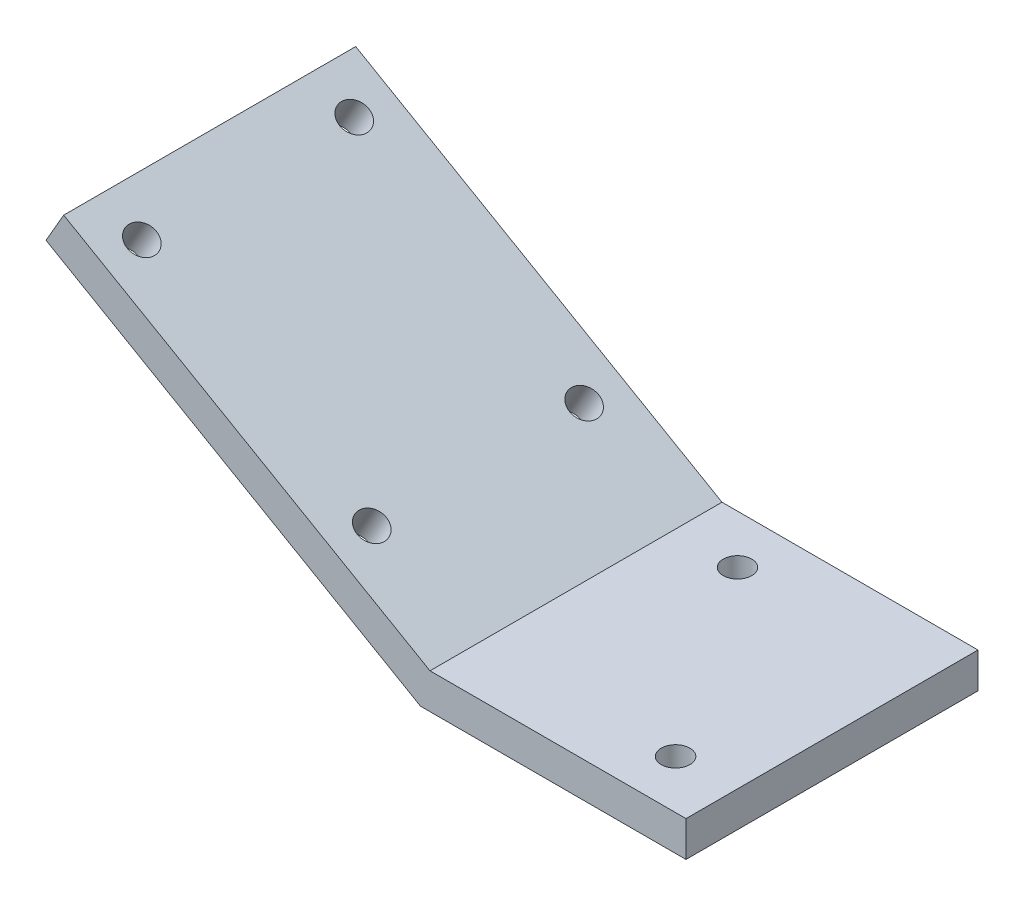
ISO-10303-21;
HEADER;
FILE_DESCRIPTION(('STEP AP214'),'2;1');
FILE_NAME('part.step','',(''),(''),'','','');
FILE_SCHEMA(('AUTOMOTIVE_DESIGN { 1 0 10303 214 1 1 1 1 }'));
ENDSEC;
DATA;
#1=APPLICATION_CONTEXT('core data for automotive mechanical design processes');
#2=APPLICATION_PROTOCOL_DEFINITION('international standard','automotive_design',2000,#1);
#3=PRODUCT_CONTEXT('',#1,'mechanical');
#4=PRODUCT('Part','Part','',(#3));
#5=PRODUCT_RELATED_PRODUCT_CATEGORY('part','',(#4));
#6=PRODUCT_DEFINITION_FORMATION('','',#4);
#7=PRODUCT_DEFINITION_CONTEXT('part definition',#1,'design');
#8=PRODUCT_DEFINITION('design','',#6,#7);
#9=PRODUCT_DEFINITION_SHAPE('','',#8);
#10=(LENGTH_UNIT() NAMED_UNIT(*) SI_UNIT(.MILLI.,.METRE.));
#11=(NAMED_UNIT(*) PLANE_ANGLE_UNIT() SI_UNIT($,.RADIAN.));
#12=(NAMED_UNIT(*) SI_UNIT($,.STERADIAN.) SOLID_ANGLE_UNIT());
#13=UNCERTAINTY_MEASURE_WITH_UNIT(LENGTH_MEASURE(1.E-05),#10,'distance_accuracy_value','');
#14=(GEOMETRIC_REPRESENTATION_CONTEXT(3) GLOBAL_UNCERTAINTY_ASSIGNED_CONTEXT((#13)) GLOBAL_UNIT_ASSIGNED_CONTEXT((#10,
#11,#12)) REPRESENTATION_CONTEXT('',''));
#15=CARTESIAN_POINT('',(0.,0.,0.));
#16=DIRECTION('',(0.,0.,1.));
#17=DIRECTION('',(1.,0.,0.));
#18=AXIS2_PLACEMENT_3D('',#15,#16,#17);
#19=CARTESIAN_POINT('',(-25.,20.,11.5));
#20=DIRECTION('',(0.,0.,-1.));
#21=DIRECTION('',(-1.,0.,0.));
#22=AXIS2_PLACEMENT_3D('',#19,#20,#21);
#23=PLANE('',#22);
#24=DIRECTION('',(-0.866025403784438,0.500000000000001,0.));
#25=VECTOR('',#24,1.);
#26=CARTESIAN_POINT('',(1.99999999999989,3.46410161513756,11.5));
#27=LINE('',#26,#25);
#28=CARTESIAN_POINT('',(1.07179676972404,4.,11.5));
#29=VERTEX_POINT('',#28);
#30=CARTESIAN_POINT('',(-40.3205080756889,27.897858344878,11.5));
#31=VERTEX_POINT('',#30);
#32=EDGE_CURVE('E75',#29,#31,#27,.T.);
#33=ORIENTED_EDGE('',*,*,#32,.T.);
#34=DIRECTION('',(0.499999999999997,0.866025403784441,0.));
#35=VECTOR('',#34,1.);
#36=CARTESIAN_POINT('',(-40.3205080756889,27.897858344878,11.5));
#37=LINE('',#36,#35);
#38=CARTESIAN_POINT('',(-42.3205080756888,24.4337567297404,11.5));
#39=VERTEX_POINT('',#38);
#40=EDGE_CURVE('E182',#39,#31,#37,.T.);
#41=ORIENTED_EDGE('',*,*,#40,.F.);
#42=DIRECTION('',(0.866025403784442,-0.499999999999995,0.));
#43=VECTOR('',#42,1.);
#44=CARTESIAN_POINT('',(0.,0.,11.5));
#45=LINE('',#44,#43);
#46=CARTESIAN_POINT('',(0.,0.,11.5));
#47=VERTEX_POINT('',#46);
#48=EDGE_CURVE('E116',#39,#47,#45,.T.);
#49=ORIENTED_EDGE('',*,*,#48,.T.);
#50=DIRECTION('',(1.,0.,0.));
#51=VECTOR('',#50,1.);
#52=CARTESIAN_POINT('',(-25.,0.,11.5));
#53=LINE('',#52,#51);
#54=CARTESIAN_POINT('',(30.,0.,11.5));
#55=VERTEX_POINT('',#54);
#56=EDGE_CURVE('E67',#47,#55,#53,.T.);
#57=ORIENTED_EDGE('',*,*,#56,.T.);
#58=DIRECTION('',(0.,-1.,0.));
#59=VECTOR('',#58,1.);
#60=CARTESIAN_POINT('',(30.,0.,11.5));
#61=LINE('',#60,#59);
#62=CARTESIAN_POINT('',(30.,4.,11.5));
#63=VERTEX_POINT('',#62);
#64=EDGE_CURVE('E114',#63,#55,#61,.T.);
#65=ORIENTED_EDGE('',*,*,#64,.F.);
#66=DIRECTION('',(-1.,0.,0.));
#67=VECTOR('',#66,1.);
#68=CARTESIAN_POINT('',(0.,4.,11.5));
#69=LINE('',#68,#67);
#70=EDGE_CURVE('E189',#63,#29,#69,.T.);
#71=ORIENTED_EDGE('',*,*,#70,.T.);
#72=EDGE_LOOP('',(#33,#41,#49,#57,#65,#71));
#73=FACE_BOUND('',#72,.T.);
#74=ADVANCED_FACE('F59',(#73),#23,.F.);
#75=CARTESIAN_POINT('',(0.,0.,0.));
#76=DIRECTION('',(0.,1.,0.));
#77=DIRECTION('',(0.,0.,1.));
#78=AXIS2_PLACEMENT_3D('',#75,#76,#77);
#79=PLANE('',#78);
#80=CARTESIAN_POINT('',(23.3222354943985,0.,6.));
#81=DIRECTION('',(0.,-1.,0.));
#82=DIRECTION('',(0.,0.,-1.));
#83=AXIS2_PLACEMENT_3D('',#80,#81,#82);
#84=CIRCLE('',#83,1.62);
#85=CARTESIAN_POINT('',(23.3222354943985,0.,4.38));
#86=VERTEX_POINT('',#85);
#87=EDGE_CURVE('E192',#86,#86,#84,.T.);
#88=ORIENTED_EDGE('',*,*,#87,.F.);
#89=EDGE_LOOP('',(#88));
#90=FACE_BOUND('',#89,.T.);
#91=CARTESIAN_POINT('',(8.3222354943985,0.,-16.));
#92=DIRECTION('',(0.,-1.,0.));
#93=DIRECTION('',(0.,0.,-1.));
#94=AXIS2_PLACEMENT_3D('',#91,#92,#93);
#95=CIRCLE('',#94,1.62);
#96=CARTESIAN_POINT('',(8.3222354943985,0.,-17.62));
#97=VERTEX_POINT('',#96);
#98=EDGE_CURVE('E138',#97,#97,#95,.T.);
#99=ORIENTED_EDGE('',*,*,#98,.F.);
#100=EDGE_LOOP('',(#99));
#101=FACE_BOUND('',#100,.T.);
#102=DIRECTION('',(0.,0.,1.));
#103=VECTOR('',#102,1.);
#104=CARTESIAN_POINT('',(0.,0.,0.));
#105=LINE('',#104,#103);
#106=CARTESIAN_POINT('',(0.,0.,-21.5));
#107=VERTEX_POINT('',#106);
#108=EDGE_CURVE('E12',#107,#47,#105,.T.);
#109=ORIENTED_EDGE('',*,*,#108,.F.);
#110=DIRECTION('',(-1.,0.,0.));
#111=VECTOR('',#110,1.);
#112=CARTESIAN_POINT('',(0.,0.,-21.5));
#113=LINE('',#112,#111);
#114=CARTESIAN_POINT('',(30.,0.,-21.5));
#115=VERTEX_POINT('',#114);
#116=EDGE_CURVE('E124',#115,#107,#113,.T.);
#117=ORIENTED_EDGE('',*,*,#116,.F.);
#118=DIRECTION('',(0.,0.,-1.));
#119=VECTOR('',#118,1.);
#120=CARTESIAN_POINT('',(30.,0.,-21.5));
#121=LINE('',#120,#119);
#122=EDGE_CURVE('E121',#55,#115,#121,.T.);
#123=ORIENTED_EDGE('',*,*,#122,.F.);
#124=ORIENTED_EDGE('',*,*,#56,.F.);
#125=EDGE_LOOP('',(#109,#117,#123,#124));
#126=FACE_BOUND('',#125,.T.);
#127=ADVANCED_FACE('F122',(#90,#101,#126),#79,.F.);
#128=CARTESIAN_POINT('',(0.,0.,-18.5));
#129=DIRECTION('',(-0.499999999999995,-0.866025403784442,0.));
#130=DIRECTION('',(0.866025403784442,-0.499999999999995,0.));
#131=AXIS2_PLACEMENT_3D('',#128,#129,#130);
#132=PLANE('',#131);
#133=CARTESIAN_POINT('',(-37.9903810567666,21.9337567297404,7.));
#134=DIRECTION('',(-0.499999999999995,-0.866025403784442,0.));
#135=DIRECTION('',(0.866025403784442,-0.499999999999995,0.));
#136=AXIS2_PLACEMENT_3D('',#133,#134,#135);
#137=CIRCLE('',#136,1.65);
#138=CARTESIAN_POINT('',(-39.419322973011,22.7587567297404,7.));
#139=VERTEX_POINT('',#138);
#140=EDGE_CURVE('E164',#139,#139,#137,.T.);
#141=ORIENTED_EDGE('',*,*,#140,.F.);
#142=EDGE_LOOP('',(#141));
#143=FACE_BOUND('',#142,.T.);
#144=CARTESIAN_POINT('',(-12.0096189432334,6.93375672974053,-17.));
#145=DIRECTION('',(-0.499999999999995,-0.866025403784442,0.));
#146=DIRECTION('',(0.866025403784442,-0.499999999999995,0.));
#147=AXIS2_PLACEMENT_3D('',#144,#145,#146);
#148=CIRCLE('',#147,1.65);
#149=CARTESIAN_POINT('',(-13.4385608594777,7.75875672974052,-17.));
#150=VERTEX_POINT('',#149);
#151=EDGE_CURVE('E161',#150,#150,#148,.T.);
#152=ORIENTED_EDGE('',*,*,#151,.F.);
#153=EDGE_LOOP('',(#152));
#154=FACE_BOUND('',#153,.T.);
#155=CARTESIAN_POINT('',(-12.0096189432334,6.93375672974053,7.));
#156=DIRECTION('',(-0.499999999999995,-0.866025403784442,0.));
#157=DIRECTION('',(0.866025403784442,-0.499999999999995,0.));
#158=AXIS2_PLACEMENT_3D('',#155,#156,#157);
#159=CIRCLE('',#158,1.65);
#160=CARTESIAN_POINT('',(-13.4385608594777,7.75875672974052,7.));
#161=VERTEX_POINT('',#160);
#162=EDGE_CURVE('E158',#161,#161,#159,.T.);
#163=ORIENTED_EDGE('',*,*,#162,.F.);
#164=EDGE_LOOP('',(#163));
#165=FACE_BOUND('',#164,.T.);
#166=CARTESIAN_POINT('',(-37.9903810567666,21.9337567297404,-17.));
#167=DIRECTION('',(-0.499999999999995,-0.866025403784442,0.));
#168=DIRECTION('',(0.866025403784442,-0.499999999999995,0.));
#169=AXIS2_PLACEMENT_3D('',#166,#167,#168);
#170=CIRCLE('',#169,1.64999999999999);
#171=CARTESIAN_POINT('',(-39.419322973011,22.7587567297404,-17.));
#172=VERTEX_POINT('',#171);
#173=EDGE_CURVE('E155',#172,#172,#170,.T.);
#174=ORIENTED_EDGE('',*,*,#173,.F.);
#175=EDGE_LOOP('',(#174));
#176=FACE_BOUND('',#175,.T.);
#177=DIRECTION('',(0.,0.,1.));
#178=VECTOR('',#177,1.);
#179=CARTESIAN_POINT('',(-42.3205080756888,24.4337567297404,11.5));
#180=LINE('',#179,#178);
#181=CARTESIAN_POINT('',(-42.3205080756888,24.4337567297404,-21.5));
#182=VERTEX_POINT('',#181);
#183=EDGE_CURVE('E179',#182,#39,#180,.T.);
#184=ORIENTED_EDGE('',*,*,#183,.F.);
#185=DIRECTION('',(-0.866025403784441,0.499999999999996,0.));
#186=VECTOR('',#185,1.);
#187=CARTESIAN_POINT('',(-42.3205080756888,24.4337567297404,-21.5));
#188=LINE('',#187,#186);
#189=EDGE_CURVE('E168',#107,#182,#188,.T.);
#190=ORIENTED_EDGE('',*,*,#189,.F.);
#191=ORIENTED_EDGE('',*,*,#108,.T.);
#192=ORIENTED_EDGE('',*,*,#48,.F.);
#193=EDGE_LOOP('',(#184,#190,#191,#192));
#194=FACE_BOUND('',#193,.T.);
#195=ADVANCED_FACE('F204',(#143,#154,#165,#176,#194),#132,.T.);
#196=CARTESIAN_POINT('',(1.99999999999989,3.46410161513756,-18.5));
#197=DIRECTION('',(0.500000000000001,0.866025403784438,0.));
#198=DIRECTION('',(-0.866025403784438,0.500000000000001,0.));
#199=AXIS2_PLACEMENT_3D('',#196,#197,#198);
#200=PLANE('',#199);
#201=CARTESIAN_POINT('',(-35.9903810567666,25.3978583448782,7.));
#202=DIRECTION('',(0.500000000000001,0.866025403784438,0.));
#203=DIRECTION('',(-0.866025403784438,0.500000000000001,0.));
#204=AXIS2_PLACEMENT_3D('',#201,#202,#203);
#205=CIRCLE('',#204,1.65);
#206=CARTESIAN_POINT('',(-37.4193229730109,26.2228583448782,7.));
#207=VERTEX_POINT('',#206);
#208=EDGE_CURVE('E147',#207,#207,#205,.T.);
#209=ORIENTED_EDGE('',*,*,#208,.F.);
#210=EDGE_LOOP('',(#209));
#211=FACE_BOUND('',#210,.T.);
#212=CARTESIAN_POINT('',(-10.0096189432334,10.3978583448782,-17.));
#213=DIRECTION('',(0.500000000000001,0.866025403784438,0.));
#214=DIRECTION('',(-0.866025403784438,0.500000000000001,0.));
#215=AXIS2_PLACEMENT_3D('',#212,#213,#214);
#216=CIRCLE('',#215,1.65);
#217=CARTESIAN_POINT('',(-11.4385608594778,11.2228583448782,-17.));
#218=VERTEX_POINT('',#217);
#219=EDGE_CURVE('E146',#218,#218,#216,.T.);
#220=ORIENTED_EDGE('',*,*,#219,.F.);
#221=EDGE_LOOP('',(#220));
#222=FACE_BOUND('',#221,.T.);
#223=CARTESIAN_POINT('',(-10.0096189432334,10.3978583448782,7.));
#224=DIRECTION('',(0.500000000000001,0.866025403784438,0.));
#225=DIRECTION('',(-0.866025403784438,0.500000000000001,0.));
#226=AXIS2_PLACEMENT_3D('',#223,#224,#225);
#227=CIRCLE('',#226,1.65);
#228=CARTESIAN_POINT('',(-11.4385608594778,11.2228583448782,7.));
#229=VERTEX_POINT('',#228);
#230=EDGE_CURVE('E143',#229,#229,#227,.T.);
#231=ORIENTED_EDGE('',*,*,#230,.F.);
#232=EDGE_LOOP('',(#231));
#233=FACE_BOUND('',#232,.T.);
#234=CARTESIAN_POINT('',(-35.9903810567666,25.3978583448782,-17.));
#235=DIRECTION('',(0.500000000000001,0.866025403784438,0.));
#236=DIRECTION('',(-0.866025403784438,0.500000000000001,0.));
#237=AXIS2_PLACEMENT_3D('',#234,#235,#236);
#238=CIRCLE('',#237,1.64999999999999);
#239=CARTESIAN_POINT('',(-37.4193229730109,26.2228583448782,-17.));
#240=VERTEX_POINT('',#239);
#241=EDGE_CURVE('E150',#240,#240,#238,.T.);
#242=ORIENTED_EDGE('',*,*,#241,.F.);
#243=EDGE_LOOP('',(#242));
#244=FACE_BOUND('',#243,.T.);
#245=DIRECTION('',(0.,0.,1.));
#246=VECTOR('',#245,1.);
#247=CARTESIAN_POINT('',(1.07179676972404,4.,-18.5));
#248=LINE('',#247,#246);
#249=CARTESIAN_POINT('',(1.07179676972404,4.,-21.5));
#250=VERTEX_POINT('',#249);
#251=EDGE_CURVE('E118',#250,#29,#248,.T.);
#252=ORIENTED_EDGE('',*,*,#251,.F.);
#253=DIRECTION('',(0.866025403784439,-0.499999999999999,0.));
#254=VECTOR('',#253,1.);
#255=CARTESIAN_POINT('',(1.07179676972404,4.,-21.5));
#256=LINE('',#255,#254);
#257=CARTESIAN_POINT('',(-40.3205080756888,27.8978583448781,-21.5));
#258=VERTEX_POINT('',#257);
#259=EDGE_CURVE('E174',#258,#250,#256,.T.);
#260=ORIENTED_EDGE('',*,*,#259,.F.);
#261=DIRECTION('',(0.,0.,-1.));
#262=VECTOR('',#261,1.);
#263=CARTESIAN_POINT('',(-40.3205080756888,27.8978583448781,-11.5));
#264=LINE('',#263,#262);
#265=EDGE_CURVE('E185',#31,#258,#264,.T.);
#266=ORIENTED_EDGE('',*,*,#265,.F.);
#267=ORIENTED_EDGE('',*,*,#32,.F.);
#268=EDGE_LOOP('',(#252,#260,#266,#267));
#269=FACE_BOUND('',#268,.T.);
#270=ADVANCED_FACE('F211',(#211,#222,#233,#244,#269),#200,.T.);
#271=CARTESIAN_POINT('',(0.,4.,-18.5));
#272=DIRECTION('',(0.,1.,0.));
#273=DIRECTION('',(0.,0.,1.));
#274=AXIS2_PLACEMENT_3D('',#271,#272,#273);
#275=PLANE('',#274);
#276=CARTESIAN_POINT('',(23.3222354943985,4.,6.));
#277=DIRECTION('',(0.,1.,0.));
#278=DIRECTION('',(0.,0.,1.));
#279=AXIS2_PLACEMENT_3D('',#276,#277,#278);
#280=CIRCLE('',#279,1.62);
#281=CARTESIAN_POINT('',(23.3222354943985,4.,7.62));
#282=VERTEX_POINT('',#281);
#283=EDGE_CURVE('E62',#282,#282,#280,.T.);
#284=ORIENTED_EDGE('',*,*,#283,.F.);
#285=EDGE_LOOP('',(#284));
#286=FACE_BOUND('',#285,.T.);
#287=CARTESIAN_POINT('',(8.3222354943985,4.,-16.));
#288=DIRECTION('',(0.,1.,0.));
#289=DIRECTION('',(0.,0.,1.));
#290=AXIS2_PLACEMENT_3D('',#287,#288,#289);
#291=CIRCLE('',#290,1.62);
#292=CARTESIAN_POINT('',(8.3222354943985,4.,-14.38));
#293=VERTEX_POINT('',#292);
#294=EDGE_CURVE('E136',#293,#293,#291,.T.);
#295=ORIENTED_EDGE('',*,*,#294,.F.);
#296=EDGE_LOOP('',(#295));
#297=FACE_BOUND('',#296,.T.);
#298=ORIENTED_EDGE('',*,*,#70,.F.);
#299=DIRECTION('',(0.,0.,1.));
#300=VECTOR('',#299,1.);
#301=CARTESIAN_POINT('',(30.,4.,11.5));
#302=LINE('',#301,#300);
#303=CARTESIAN_POINT('',(30.,4.,-21.5));
#304=VERTEX_POINT('',#303);
#305=EDGE_CURVE('E133',#304,#63,#302,.T.);
#306=ORIENTED_EDGE('',*,*,#305,.F.);
#307=DIRECTION('',(1.,0.,0.));
#308=VECTOR('',#307,1.);
#309=CARTESIAN_POINT('',(25.,4.,-21.5));
#310=LINE('',#309,#308);
#311=EDGE_CURVE('E177',#250,#304,#310,.T.);
#312=ORIENTED_EDGE('',*,*,#311,.F.);
#313=ORIENTED_EDGE('',*,*,#251,.T.);
#314=EDGE_LOOP('',(#298,#306,#312,#313));
#315=FACE_BOUND('',#314,.T.);
#316=ADVANCED_FACE('F217',(#286,#297,#315),#275,.T.);
#317=CARTESIAN_POINT('',(-42.3205080756888,24.4337567297404,0.));
#318=DIRECTION('',(0.86602540378444,-0.499999999999997,0.));
#319=DIRECTION('',(0.499999999999997,0.86602540378444,0.));
#320=AXIS2_PLACEMENT_3D('',#317,#318,#319);
#321=PLANE('',#320);
#322=ORIENTED_EDGE('',*,*,#265,.T.);
#323=DIRECTION('',(0.499999999999997,0.86602540378444,0.));
#324=VECTOR('',#323,1.);
#325=CARTESIAN_POINT('',(-40.3205080756888,27.8978583448781,-21.5));
#326=LINE('',#325,#324);
#327=EDGE_CURVE('E171',#182,#258,#326,.T.);
#328=ORIENTED_EDGE('',*,*,#327,.F.);
#329=ORIENTED_EDGE('',*,*,#183,.T.);
#330=ORIENTED_EDGE('',*,*,#40,.T.);
#331=EDGE_LOOP('',(#322,#328,#329,#330));
#332=FACE_BOUND('',#331,.T.);
#333=ADVANCED_FACE('F219',(#332),#321,.F.);
#334=CARTESIAN_POINT('',(0.,0.,-21.5));
#335=DIRECTION('',(0.,0.,1.));
#336=DIRECTION('',(1.,0.,0.));
#337=AXIS2_PLACEMENT_3D('',#334,#335,#336);
#338=PLANE('',#337);
#339=ORIENTED_EDGE('',*,*,#311,.T.);
#340=DIRECTION('',(0.,1.,0.));
#341=VECTOR('',#340,1.);
#342=CARTESIAN_POINT('',(30.,4.,-21.5));
#343=LINE('',#342,#341);
#344=EDGE_CURVE('E128',#115,#304,#343,.T.);
#345=ORIENTED_EDGE('',*,*,#344,.F.);
#346=ORIENTED_EDGE('',*,*,#116,.T.);
#347=ORIENTED_EDGE('',*,*,#189,.T.);
#348=ORIENTED_EDGE('',*,*,#327,.T.);
#349=ORIENTED_EDGE('',*,*,#259,.T.);
#350=EDGE_LOOP('',(#339,#345,#346,#347,#348,#349));
#351=FACE_BOUND('',#350,.T.);
#352=ADVANCED_FACE('F224',(#351),#338,.F.);
#353=CARTESIAN_POINT('',(-40.9903810567666,16.7376043070338,-17.));
#354=DIRECTION('',(0.500000000000001,0.866025403784438,0.));
#355=DIRECTION('',(-0.866025403784438,0.500000000000001,0.));
#356=AXIS2_PLACEMENT_3D('',#353,#354,#355);
#357=CYLINDRICAL_SURFACE('',#356,1.64999999999999);
#358=CARTESIAN_POINT('',(-39.419322973011,22.7587567297404,-17.));
#359=CARTESIAN_POINT('',(-39.3984896396776,22.7948411215647,-17.));
#360=CARTESIAN_POINT('',(-39.3776563063443,22.8309255133891,-17.));
#361=CARTESIAN_POINT('',(-39.3359896396776,22.9030942970378,-17.));
#362=CARTESIAN_POINT('',(-39.3151563063443,22.9391786888621,-17.));
#363=CARTESIAN_POINT('',(-39.2734896396776,23.0113474725108,-17.));
#364=CARTESIAN_POINT('',(-39.2526563063443,23.0474318643352,-17.));
#365=CARTESIAN_POINT('',(-39.2109896396776,23.1196006479839,-17.));
#366=CARTESIAN_POINT('',(-39.1901563063443,23.1556850398082,-17.));
#367=CARTESIAN_POINT('',(-39.1484896396776,23.2278538234569,-17.));
#368=CARTESIAN_POINT('',(-39.1276563063443,23.2639382152813,-17.));
#369=CARTESIAN_POINT('',(-39.0859896396776,23.33610699893,-17.));
#370=CARTESIAN_POINT('',(-39.0651563063443,23.3721913907543,-17.));
#371=CARTESIAN_POINT('',(-39.0234896396776,23.4443601744031,-17.));
#372=CARTESIAN_POINT('',(-39.0026563063443,23.4804445662274,-17.));
#373=CARTESIAN_POINT('',(-38.9609896396776,23.5526133498761,-17.));
#374=CARTESIAN_POINT('',(-38.9401563063443,23.5886977417005,-17.));
#375=CARTESIAN_POINT('',(-38.8984896396776,23.6608665253492,-17.));
#376=CARTESIAN_POINT('',(-38.8776563063443,23.6969509171735,-17.));
#377=CARTESIAN_POINT('',(-38.8359896396776,23.7691197008222,-17.));
#378=CARTESIAN_POINT('',(-38.8151563063443,23.8052040926466,-17.));
#379=CARTESIAN_POINT('',(-38.7734896396776,23.8773728762953,-17.));
#380=CARTESIAN_POINT('',(-38.7526563063443,23.9134572681196,-17.));
#381=CARTESIAN_POINT('',(-38.7109896396776,23.9856260517683,-17.));
#382=CARTESIAN_POINT('',(-38.6901563063443,24.0217104435927,-17.));
#383=CARTESIAN_POINT('',(-38.6484896396776,24.0938792272414,-17.));
#384=CARTESIAN_POINT('',(-38.6276563063443,24.1299636190658,-17.));
#385=CARTESIAN_POINT('',(-38.5859896396776,24.2021324027145,-17.));
#386=CARTESIAN_POINT('',(-38.5651563063443,24.2382167945388,-17.));
#387=CARTESIAN_POINT('',(-38.5234896396776,24.3103855781875,-17.));
#388=CARTESIAN_POINT('',(-38.5026563063443,24.3464699700119,-17.));
#389=CARTESIAN_POINT('',(-38.4609896396776,24.4186387536606,-17.));
#390=CARTESIAN_POINT('',(-38.4401563063443,24.4547231454849,-17.));
#391=CARTESIAN_POINT('',(-38.3984896396776,24.5268919291336,-17.));
#392=CARTESIAN_POINT('',(-38.3776563063443,24.562976320958,-17.));
#393=CARTESIAN_POINT('',(-38.3359896396776,24.6351451046067,-17.));
#394=CARTESIAN_POINT('',(-38.3151563063443,24.671229496431,-17.));
#395=CARTESIAN_POINT('',(-38.2734896396776,24.7433982800798,-17.));
#396=CARTESIAN_POINT('',(-38.2526563063443,24.7794826719041,-17.));
#397=CARTESIAN_POINT('',(-38.2109896396776,24.8516514555528,-17.));
#398=CARTESIAN_POINT('',(-38.1901563063443,24.8877358473772,-17.));
#399=CARTESIAN_POINT('',(-38.1484896396776,24.9599046310259,-17.));
#400=CARTESIAN_POINT('',(-38.1276563063443,24.9959890228502,-17.));
#401=CARTESIAN_POINT('',(-38.0859896396776,25.0681578064989,-17.));
#402=CARTESIAN_POINT('',(-38.0651563063442,25.1042421983233,-17.));
#403=CARTESIAN_POINT('',(-38.0234896396776,25.176410981972,-17.));
#404=CARTESIAN_POINT('',(-38.0026563063443,25.2124953737963,-17.));
#405=CARTESIAN_POINT('',(-37.9609896396776,25.284664157445,-17.));
#406=CARTESIAN_POINT('',(-37.9401563063442,25.3207485492694,-17.));
#407=CARTESIAN_POINT('',(-37.8984896396776,25.3929173329181,-17.));
#408=CARTESIAN_POINT('',(-37.8776563063442,25.4290017247424,-17.));
#409=CARTESIAN_POINT('',(-37.8359896396776,25.5011705083912,-17.));
#410=CARTESIAN_POINT('',(-37.8151563063442,25.5372549002155,-17.));
#411=CARTESIAN_POINT('',(-37.7734896396776,25.6094236838642,-17.));
#412=CARTESIAN_POINT('',(-37.7526563063442,25.6455080756886,-17.));
#413=CARTESIAN_POINT('',(-37.7109896396776,25.7176768593373,-17.));
#414=CARTESIAN_POINT('',(-37.6901563063442,25.7537612511616,-17.));
#415=CARTESIAN_POINT('',(-37.6484896396776,25.8259300348103,-17.));
#416=CARTESIAN_POINT('',(-37.6276563063442,25.8620144266347,-17.));
#417=CARTESIAN_POINT('',(-37.5859896396776,25.9341832102834,-17.));
#418=CARTESIAN_POINT('',(-37.5651563063442,25.9702676021077,-17.));
#419=CARTESIAN_POINT('',(-37.5234896396776,26.0424363857564,-17.));
#420=CARTESIAN_POINT('',(-37.5026563063442,26.0785207775808,-17.));
#421=CARTESIAN_POINT('',(-37.4609896396776,26.1506895612295,-17.));
#422=CARTESIAN_POINT('',(-37.4401563063442,26.1867739530539,-17.));
#423=CARTESIAN_POINT('',(-37.4193229730109,26.2228583448782,-17.));
#424=B_SPLINE_CURVE_WITH_KNOTS('',3,(#358,#359,#360,#361,#362,#363,#364,#365,#366,#367,#368,
#369,#370,#371,#372,#373,#374,#375,#376,#377,#378,#379,#380,#381,#382,#383,#384,#385,#386,#387,
#388,#389,#390,#391,#392,#393,#394,#395,#396,#397,#398,#399,#400,#401,#402,#403,#404,#405,#406,
#407,#408,#409,#410,#411,#412,#413,#414,#415,#416,#417,#418,#419,#420,#421,#422,#423),
.UNSPECIFIED.,.F.,.F.,(4,2,2,2,2,2,2,2,2,2,2,2,2,2,2,2,2,2,2,2,2,2,2,2,2,2,2,2,2,2,2,2,4),(0.,
0.125000000000003,0.250000000000007,0.375000000000014,0.500000000000014,0.625000000000018,
0.750000000000021,0.875000000000025,1.00000000000003,1.12500000000003,1.25000000000004,
1.37500000000004,1.50000000000004,1.62500000000005,1.75000000000005,1.87500000000005,
2.00000000000006,2.12500000000006,2.25000000000007,2.37500000000007,2.50000000000007,
2.62500000000008,2.75000000000008,2.87500000000009,3.00000000000009,3.12500000000009,
3.2500000000001,3.37500000000011,3.50000000000011,3.62500000000011,3.75000000000011,
3.87500000000012,4.00000000000012),.UNSPECIFIED.);
#425=EDGE_CURVE('BSEAM228',#172,#240,#424,.T.);
#426=ORIENTED_EDGE('',*,*,#173,.T.);
#427=ORIENTED_EDGE('',*,*,#241,.T.);
#428=ORIENTED_EDGE('',*,*,#425,.T.);
#429=ORIENTED_EDGE('',*,*,#425,.F.);
#430=EDGE_LOOP('',(#426,#428,#427,#429));
#431=FACE_BOUND('',#430,.T.);
#432=ADVANCED_FACE('F228',(#431),#357,.F.);
#433=CARTESIAN_POINT('',(-15.0096189432335,1.7376043070338,7.));
#434=DIRECTION('',(0.500000000000001,0.866025403784438,0.));
#435=DIRECTION('',(-0.866025403784438,0.500000000000001,0.));
#436=AXIS2_PLACEMENT_3D('',#433,#434,#435);
#437=CYLINDRICAL_SURFACE('',#436,1.65);
#438=CARTESIAN_POINT('',(-13.4385608594777,7.75875672974052,7.));
#439=CARTESIAN_POINT('',(-13.4177275261444,7.79484112156487,7.));
#440=CARTESIAN_POINT('',(-13.3968941928111,7.83092551338922,7.));
#441=CARTESIAN_POINT('',(-13.3552275261444,7.90309429703793,7.));
#442=CARTESIAN_POINT('',(-13.3343941928111,7.93917868886227,7.));
#443=CARTESIAN_POINT('',(-13.2927275261444,8.01134747251098,7.));
#444=CARTESIAN_POINT('',(-13.2718941928111,8.04743186433533,7.));
#445=CARTESIAN_POINT('',(-13.2302275261444,8.11960064798403,7.));
#446=CARTESIAN_POINT('',(-13.2093941928111,8.15568503980838,7.));
#447=CARTESIAN_POINT('',(-13.1677275261444,8.22785382345708,7.));
#448=CARTESIAN_POINT('',(-13.1468941928111,8.26393821528143,7.));
#449=CARTESIAN_POINT('',(-13.1052275261444,8.33610699893013,7.));
#450=CARTESIAN_POINT('',(-13.0843941928111,8.37219139075448,7.));
#451=CARTESIAN_POINT('',(-13.0427275261444,8.44436017440318,7.));
#452=CARTESIAN_POINT('',(-13.0218941928111,8.48044456622753,7.));
#453=CARTESIAN_POINT('',(-12.9802275261444,8.55261334987624,7.));
#454=CARTESIAN_POINT('',(-12.9593941928111,8.58869774170059,7.));
#455=CARTESIAN_POINT('',(-12.9177275261444,8.66086652534929,7.));
#456=CARTESIAN_POINT('',(-12.8968941928111,8.69695091717364,7.));
#457=CARTESIAN_POINT('',(-12.8552275261444,8.76911970082234,7.));
#458=CARTESIAN_POINT('',(-12.8343941928111,8.80520409264669,7.));
#459=CARTESIAN_POINT('',(-12.7927275261444,8.87737287629539,7.));
#460=CARTESIAN_POINT('',(-12.7718941928111,8.91345726811974,7.));
#461=CARTESIAN_POINT('',(-12.7302275261444,8.98562605176844,7.));
#462=CARTESIAN_POINT('',(-12.7093941928111,9.02171044359279,7.));
#463=CARTESIAN_POINT('',(-12.6677275261444,9.0938792272415,7.));
#464=CARTESIAN_POINT('',(-12.6468941928111,9.12996361906585,7.));
#465=CARTESIAN_POINT('',(-12.6052275261444,9.20213240271455,7.));
#466=CARTESIAN_POINT('',(-12.5843941928111,9.2382167945389,7.));
#467=CARTESIAN_POINT('',(-12.5427275261444,9.3103855781876,7.));
#468=CARTESIAN_POINT('',(-12.5218941928111,9.34646997001195,7.));
#469=CARTESIAN_POINT('',(-12.4802275261444,9.41863875366065,7.));
#470=CARTESIAN_POINT('',(-12.4593941928111,9.454723145485,7.));
#471=CARTESIAN_POINT('',(-12.4177275261444,9.5268919291337,7.));
#472=CARTESIAN_POINT('',(-12.3968941928111,9.56297632095805,7.));
#473=CARTESIAN_POINT('',(-12.3552275261444,9.63514510460675,7.));
#474=CARTESIAN_POINT('',(-12.3343941928111,9.6712294964311,7.));
#475=CARTESIAN_POINT('',(-12.2927275261444,9.74339828007981,7.));
#476=CARTESIAN_POINT('',(-12.2718941928111,9.77948267190416,7.));
#477=CARTESIAN_POINT('',(-12.2302275261444,9.85165145555286,7.));
#478=CARTESIAN_POINT('',(-12.2093941928111,9.88773584737721,7.));
#479=CARTESIAN_POINT('',(-12.1677275261444,9.95990463102591,7.));
#480=CARTESIAN_POINT('',(-12.1468941928111,9.99598902285026,7.));
#481=CARTESIAN_POINT('',(-12.1052275261444,10.068157806499,7.));
#482=CARTESIAN_POINT('',(-12.0843941928111,10.1042421983233,7.));
#483=CARTESIAN_POINT('',(-12.0427275261444,10.176410981972,7.));
#484=CARTESIAN_POINT('',(-12.0218941928111,10.2124953737964,7.));
#485=CARTESIAN_POINT('',(-11.9802275261444,10.2846641574451,7.));
#486=CARTESIAN_POINT('',(-11.9593941928111,10.3207485492694,7.));
#487=CARTESIAN_POINT('',(-11.9177275261444,10.3929173329181,7.));
#488=CARTESIAN_POINT('',(-11.8968941928111,10.4290017247425,7.));
#489=CARTESIAN_POINT('',(-11.8552275261444,10.5011705083912,7.));
#490=CARTESIAN_POINT('',(-11.8343941928111,10.5372549002155,7.));
#491=CARTESIAN_POINT('',(-11.7927275261444,10.6094236838642,7.));
#492=CARTESIAN_POINT('',(-11.7718941928111,10.6455080756886,7.));
#493=CARTESIAN_POINT('',(-11.7302275261444,10.7176768593373,7.));
#494=CARTESIAN_POINT('',(-11.7093941928111,10.7537612511616,7.));
#495=CARTESIAN_POINT('',(-11.6677275261444,10.8259300348103,7.));
#496=CARTESIAN_POINT('',(-11.6468941928111,10.8620144266347,7.));
#497=CARTESIAN_POINT('',(-11.6052275261444,10.9341832102834,7.));
#498=CARTESIAN_POINT('',(-11.5843941928111,10.9702676021077,7.));
#499=CARTESIAN_POINT('',(-11.5427275261444,11.0424363857564,7.));
#500=CARTESIAN_POINT('',(-11.5218941928111,11.0785207775808,7.));
#501=CARTESIAN_POINT('',(-11.4802275261444,11.1506895612295,7.));
#502=CARTESIAN_POINT('',(-11.4593941928111,11.1867739530538,7.));
#503=CARTESIAN_POINT('',(-11.4385608594778,11.2228583448782,7.));
#504=B_SPLINE_CURVE_WITH_KNOTS('',3,(#438,#439,#440,#441,#442,#443,#444,#445,#446,#447,#448,
#449,#450,#451,#452,#453,#454,#455,#456,#457,#458,#459,#460,#461,#462,#463,#464,#465,#466,#467,
#468,#469,#470,#471,#472,#473,#474,#475,#476,#477,#478,#479,#480,#481,#482,#483,#484,#485,#486,
#487,#488,#489,#490,#491,#492,#493,#494,#495,#496,#497,#498,#499,#500,#501,#502,#503),
.UNSPECIFIED.,.F.,.F.,(4,2,2,2,2,2,2,2,2,2,2,2,2,2,2,2,2,2,2,2,2,2,2,2,2,2,2,2,2,2,2,2,4),(0.,
0.124999999999997,0.249999999999994,0.37499999999999,0.499999999999987,0.624999999999984,
0.749999999999981,0.874999999999977,0.999999999999974,1.12499999999997,1.24999999999997,
1.37499999999996,1.49999999999996,1.62499999999996,1.74999999999995,1.87499999999995,
1.99999999999995,2.12499999999994,2.24999999999994,2.37499999999994,2.49999999999994,
2.62499999999993,2.74999999999993,2.87499999999992,2.99999999999992,3.12499999999992,
3.24999999999991,3.37499999999991,3.49999999999991,3.6249999999999,3.7499999999999,
3.8749999999999,3.99999999999989),.UNSPECIFIED.);
#505=EDGE_CURVE('BSEAM232',#161,#229,#504,.T.);
#506=ORIENTED_EDGE('',*,*,#162,.T.);
#507=ORIENTED_EDGE('',*,*,#230,.T.);
#508=ORIENTED_EDGE('',*,*,#505,.T.);
#509=ORIENTED_EDGE('',*,*,#505,.F.);
#510=EDGE_LOOP('',(#506,#508,#507,#509));
#511=FACE_BOUND('',#510,.T.);
#512=ADVANCED_FACE('F232',(#511),#437,.F.);
#513=CARTESIAN_POINT('',(-15.0096189432335,1.7376043070338,-17.));
#514=DIRECTION('',(0.500000000000001,0.866025403784438,0.));
#515=DIRECTION('',(-0.866025403784438,0.500000000000001,0.));
#516=AXIS2_PLACEMENT_3D('',#513,#514,#515);
#517=CYLINDRICAL_SURFACE('',#516,1.65);
#518=CARTESIAN_POINT('',(-13.4385608594777,7.75875672974052,-17.));
#519=CARTESIAN_POINT('',(-13.4177275261444,7.79484112156487,-17.));
#520=CARTESIAN_POINT('',(-13.3968941928111,7.83092551338922,-17.));
#521=CARTESIAN_POINT('',(-13.3552275261444,7.90309429703792,-17.));
#522=CARTESIAN_POINT('',(-13.3343941928111,7.93917868886227,-17.));
#523=CARTESIAN_POINT('',(-13.2927275261444,8.01134747251098,-17.));
#524=CARTESIAN_POINT('',(-13.2718941928111,8.04743186433532,-17.));
#525=CARTESIAN_POINT('',(-13.2302275261444,8.11960064798403,-17.));
#526=CARTESIAN_POINT('',(-13.2093941928111,8.15568503980838,-17.));
#527=CARTESIAN_POINT('',(-13.1677275261444,8.22785382345708,-17.));
#528=CARTESIAN_POINT('',(-13.1468941928111,8.26393821528143,-17.));
#529=CARTESIAN_POINT('',(-13.1052275261444,8.33610699893013,-17.));
#530=CARTESIAN_POINT('',(-13.0843941928111,8.37219139075448,-17.));
#531=CARTESIAN_POINT('',(-13.0427275261444,8.44436017440318,-17.));
#532=CARTESIAN_POINT('',(-13.0218941928111,8.48044456622753,-17.));
#533=CARTESIAN_POINT('',(-12.9802275261444,8.55261334987623,-17.));
#534=CARTESIAN_POINT('',(-12.9593941928111,8.58869774170058,-17.));
#535=CARTESIAN_POINT('',(-12.9177275261444,8.66086652534929,-17.));
#536=CARTESIAN_POINT('',(-12.8968941928111,8.69695091717364,-17.));
#537=CARTESIAN_POINT('',(-12.8552275261444,8.76911970082234,-17.));
#538=CARTESIAN_POINT('',(-12.8343941928111,8.80520409264669,-17.));
#539=CARTESIAN_POINT('',(-12.7927275261444,8.87737287629539,-17.));
#540=CARTESIAN_POINT('',(-12.7718941928111,8.91345726811974,-17.));
#541=CARTESIAN_POINT('',(-12.7302275261444,8.98562605176844,-17.));
#542=CARTESIAN_POINT('',(-12.7093941928111,9.02171044359279,-17.));
#543=CARTESIAN_POINT('',(-12.6677275261444,9.0938792272415,-17.));
#544=CARTESIAN_POINT('',(-12.6468941928111,9.12996361906585,-17.));
#545=CARTESIAN_POINT('',(-12.6052275261444,9.20213240271455,-17.));
#546=CARTESIAN_POINT('',(-12.5843941928111,9.2382167945389,-17.));
#547=CARTESIAN_POINT('',(-12.5427275261444,9.3103855781876,-17.));
#548=CARTESIAN_POINT('',(-12.5218941928111,9.34646997001195,-17.));
#549=CARTESIAN_POINT('',(-12.4802275261444,9.41863875366065,-17.));
#550=CARTESIAN_POINT('',(-12.4593941928111,9.454723145485,-17.));
#551=CARTESIAN_POINT('',(-12.4177275261444,9.5268919291337,-17.));
#552=CARTESIAN_POINT('',(-12.3968941928111,9.56297632095805,-17.));
#553=CARTESIAN_POINT('',(-12.3552275261444,9.63514510460675,-17.));
#554=CARTESIAN_POINT('',(-12.3343941928111,9.6712294964311,-17.));
#555=CARTESIAN_POINT('',(-12.2927275261444,9.74339828007981,-17.));
#556=CARTESIAN_POINT('',(-12.2718941928111,9.77948267190416,-17.));
#557=CARTESIAN_POINT('',(-12.2302275261444,9.85165145555286,-17.));
#558=CARTESIAN_POINT('',(-12.2093941928111,9.88773584737721,-17.));
#559=CARTESIAN_POINT('',(-12.1677275261444,9.95990463102591,-17.));
#560=CARTESIAN_POINT('',(-12.1468941928111,9.99598902285026,-17.));
#561=CARTESIAN_POINT('',(-12.1052275261444,10.068157806499,-17.));
#562=CARTESIAN_POINT('',(-12.0843941928111,10.1042421983233,-17.));
#563=CARTESIAN_POINT('',(-12.0427275261444,10.176410981972,-17.));
#564=CARTESIAN_POINT('',(-12.0218941928111,10.2124953737964,-17.));
#565=CARTESIAN_POINT('',(-11.9802275261444,10.2846641574451,-17.));
#566=CARTESIAN_POINT('',(-11.9593941928111,10.3207485492694,-17.));
#567=CARTESIAN_POINT('',(-11.9177275261444,10.3929173329181,-17.));
#568=CARTESIAN_POINT('',(-11.8968941928111,10.4290017247425,-17.));
#569=CARTESIAN_POINT('',(-11.8552275261444,10.5011705083912,-17.));
#570=CARTESIAN_POINT('',(-11.8343941928111,10.5372549002155,-17.));
#571=CARTESIAN_POINT('',(-11.7927275261444,10.6094236838642,-17.));
#572=CARTESIAN_POINT('',(-11.7718941928111,10.6455080756886,-17.));
#573=CARTESIAN_POINT('',(-11.7302275261444,10.7176768593373,-17.));
#574=CARTESIAN_POINT('',(-11.7093941928111,10.7537612511616,-17.));
#575=CARTESIAN_POINT('',(-11.6677275261444,10.8259300348103,-17.));
#576=CARTESIAN_POINT('',(-11.6468941928111,10.8620144266347,-17.));
#577=CARTESIAN_POINT('',(-11.6052275261444,10.9341832102834,-17.));
#578=CARTESIAN_POINT('',(-11.5843941928111,10.9702676021077,-17.));
#579=CARTESIAN_POINT('',(-11.5427275261444,11.0424363857564,-17.));
#580=CARTESIAN_POINT('',(-11.5218941928111,11.0785207775808,-17.));
#581=CARTESIAN_POINT('',(-11.4802275261444,11.1506895612295,-17.));
#582=CARTESIAN_POINT('',(-11.4593941928111,11.1867739530538,-17.));
#583=CARTESIAN_POINT('',(-11.4385608594778,11.2228583448782,-17.));
#584=B_SPLINE_CURVE_WITH_KNOTS('',3,(#518,#519,#520,#521,#522,#523,#524,#525,#526,#527,#528,
#529,#530,#531,#532,#533,#534,#535,#536,#537,#538,#539,#540,#541,#542,#543,#544,#545,#546,#547,
#548,#549,#550,#551,#552,#553,#554,#555,#556,#557,#558,#559,#560,#561,#562,#563,#564,#565,#566,
#567,#568,#569,#570,#571,#572,#573,#574,#575,#576,#577,#578,#579,#580,#581,#582,#583),
.UNSPECIFIED.,.F.,.F.,(4,2,2,2,2,2,2,2,2,2,2,2,2,2,2,2,2,2,2,2,2,2,2,2,2,2,2,2,2,2,2,2,4),(0.,
0.124999999999996,0.249999999999992,0.374999999999989,0.499999999999986,0.624999999999984,
0.749999999999981,0.874999999999976,0.999999999999973,1.12499999999997,1.24999999999997,
1.37499999999996,1.49999999999996,1.62499999999996,1.74999999999995,1.87499999999995,
1.99999999999995,2.12499999999994,2.24999999999994,2.37499999999994,2.49999999999994,
2.62499999999993,2.74999999999993,2.87499999999993,2.99999999999992,3.12499999999992,
3.24999999999992,3.37499999999991,3.49999999999991,3.62499999999991,3.7499999999999,
3.8749999999999,3.9999999999999),.UNSPECIFIED.);
#585=EDGE_CURVE('BSEAM234',#150,#218,#584,.T.);
#586=ORIENTED_EDGE('',*,*,#151,.T.);
#587=ORIENTED_EDGE('',*,*,#219,.T.);
#588=ORIENTED_EDGE('',*,*,#585,.T.);
#589=ORIENTED_EDGE('',*,*,#585,.F.);
#590=EDGE_LOOP('',(#586,#588,#587,#589));
#591=FACE_BOUND('',#590,.T.);
#592=ADVANCED_FACE('F234',(#591),#517,.F.);
#593=CARTESIAN_POINT('',(-40.9903810567666,16.7376043070338,7.));
#594=DIRECTION('',(0.500000000000001,0.866025403784438,0.));
#595=DIRECTION('',(-0.866025403784438,0.500000000000001,0.));
#596=AXIS2_PLACEMENT_3D('',#593,#594,#595);
#597=CYLINDRICAL_SURFACE('',#596,1.65);
#598=CARTESIAN_POINT('',(-39.419322973011,22.7587567297404,7.));
#599=CARTESIAN_POINT('',(-39.3984896396776,22.7948411215647,7.));
#600=CARTESIAN_POINT('',(-39.3776563063443,22.8309255133891,7.));
#601=CARTESIAN_POINT('',(-39.3359896396776,22.9030942970378,7.));
#602=CARTESIAN_POINT('',(-39.3151563063443,22.9391786888621,7.));
#603=CARTESIAN_POINT('',(-39.2734896396776,23.0113474725108,7.));
#604=CARTESIAN_POINT('',(-39.2526563063443,23.0474318643352,7.));
#605=CARTESIAN_POINT('',(-39.2109896396776,23.1196006479839,7.));
#606=CARTESIAN_POINT('',(-39.1901563063443,23.1556850398082,7.));
#607=CARTESIAN_POINT('',(-39.1484896396776,23.2278538234569,7.));
#608=CARTESIAN_POINT('',(-39.1276563063443,23.2639382152813,7.));
#609=CARTESIAN_POINT('',(-39.0859896396776,23.33610699893,7.));
#610=CARTESIAN_POINT('',(-39.0651563063443,23.3721913907543,7.));
#611=CARTESIAN_POINT('',(-39.0234896396776,23.4443601744031,7.));
#612=CARTESIAN_POINT('',(-39.0026563063443,23.4804445662274,7.));
#613=CARTESIAN_POINT('',(-38.9609896396776,23.5526133498761,7.));
#614=CARTESIAN_POINT('',(-38.9401563063443,23.5886977417005,7.));
#615=CARTESIAN_POINT('',(-38.8984896396776,23.6608665253492,7.));
#616=CARTESIAN_POINT('',(-38.8776563063443,23.6969509171735,7.));
#617=CARTESIAN_POINT('',(-38.8359896396776,23.7691197008222,7.));
#618=CARTESIAN_POINT('',(-38.8151563063443,23.8052040926466,7.));
#619=CARTESIAN_POINT('',(-38.7734896396776,23.8773728762953,7.));
#620=CARTESIAN_POINT('',(-38.7526563063443,23.9134572681196,7.));
#621=CARTESIAN_POINT('',(-38.7109896396776,23.9856260517683,7.));
#622=CARTESIAN_POINT('',(-38.6901563063443,24.0217104435927,7.));
#623=CARTESIAN_POINT('',(-38.6484896396776,24.0938792272414,7.));
#624=CARTESIAN_POINT('',(-38.6276563063443,24.1299636190658,7.));
#625=CARTESIAN_POINT('',(-38.5859896396776,24.2021324027145,7.));
#626=CARTESIAN_POINT('',(-38.5651563063443,24.2382167945388,7.));
#627=CARTESIAN_POINT('',(-38.5234896396776,24.3103855781875,7.));
#628=CARTESIAN_POINT('',(-38.5026563063443,24.3464699700119,7.));
#629=CARTESIAN_POINT('',(-38.4609896396776,24.4186387536606,7.));
#630=CARTESIAN_POINT('',(-38.4401563063443,24.4547231454849,7.));
#631=CARTESIAN_POINT('',(-38.3984896396776,24.5268919291336,7.));
#632=CARTESIAN_POINT('',(-38.3776563063443,24.562976320958,7.));
#633=CARTESIAN_POINT('',(-38.3359896396776,24.6351451046067,7.));
#634=CARTESIAN_POINT('',(-38.3151563063443,24.671229496431,7.));
#635=CARTESIAN_POINT('',(-38.2734896396776,24.7433982800798,7.));
#636=CARTESIAN_POINT('',(-38.2526563063443,24.7794826719041,7.));
#637=CARTESIAN_POINT('',(-38.2109896396776,24.8516514555528,7.));
#638=CARTESIAN_POINT('',(-38.1901563063443,24.8877358473772,7.));
#639=CARTESIAN_POINT('',(-38.1484896396776,24.9599046310259,7.));
#640=CARTESIAN_POINT('',(-38.1276563063443,24.9959890228502,7.));
#641=CARTESIAN_POINT('',(-38.0859896396776,25.0681578064989,7.));
#642=CARTESIAN_POINT('',(-38.0651563063442,25.1042421983233,7.));
#643=CARTESIAN_POINT('',(-38.0234896396776,25.176410981972,7.));
#644=CARTESIAN_POINT('',(-38.0026563063443,25.2124953737963,7.));
#645=CARTESIAN_POINT('',(-37.9609896396776,25.284664157445,7.));
#646=CARTESIAN_POINT('',(-37.9401563063442,25.3207485492694,7.));
#647=CARTESIAN_POINT('',(-37.8984896396776,25.3929173329181,7.));
#648=CARTESIAN_POINT('',(-37.8776563063442,25.4290017247424,7.));
#649=CARTESIAN_POINT('',(-37.8359896396776,25.5011705083912,7.));
#650=CARTESIAN_POINT('',(-37.8151563063442,25.5372549002155,7.));
#651=CARTESIAN_POINT('',(-37.7734896396776,25.6094236838642,7.));
#652=CARTESIAN_POINT('',(-37.7526563063442,25.6455080756886,7.));
#653=CARTESIAN_POINT('',(-37.7109896396776,25.7176768593373,7.));
#654=CARTESIAN_POINT('',(-37.6901563063442,25.7537612511616,7.));
#655=CARTESIAN_POINT('',(-37.6484896396776,25.8259300348103,7.));
#656=CARTESIAN_POINT('',(-37.6276563063442,25.8620144266347,7.));
#657=CARTESIAN_POINT('',(-37.5859896396776,25.9341832102834,7.));
#658=CARTESIAN_POINT('',(-37.5651563063442,25.9702676021077,7.));
#659=CARTESIAN_POINT('',(-37.5234896396776,26.0424363857564,7.));
#660=CARTESIAN_POINT('',(-37.5026563063442,26.0785207775808,7.));
#661=CARTESIAN_POINT('',(-37.4609896396776,26.1506895612295,7.));
#662=CARTESIAN_POINT('',(-37.4401563063442,26.1867739530539,7.));
#663=CARTESIAN_POINT('',(-37.4193229730109,26.2228583448782,7.));
#664=B_SPLINE_CURVE_WITH_KNOTS('',3,(#598,#599,#600,#601,#602,#603,#604,#605,#606,#607,#608,
#609,#610,#611,#612,#613,#614,#615,#616,#617,#618,#619,#620,#621,#622,#623,#624,#625,#626,#627,
#628,#629,#630,#631,#632,#633,#634,#635,#636,#637,#638,#639,#640,#641,#642,#643,#644,#645,#646,
#647,#648,#649,#650,#651,#652,#653,#654,#655,#656,#657,#658,#659,#660,#661,#662,#663),
.UNSPECIFIED.,.F.,.F.,(4,2,2,2,2,2,2,2,2,2,2,2,2,2,2,2,2,2,2,2,2,2,2,2,2,2,2,2,2,2,2,2,4),(0.,
0.125000000000003,0.250000000000007,0.375000000000014,0.500000000000014,0.625000000000018,
0.750000000000021,0.875000000000025,1.00000000000003,1.12500000000003,1.25000000000004,
1.37500000000004,1.50000000000004,1.62500000000005,1.75000000000005,1.87500000000005,
2.00000000000006,2.12500000000006,2.25000000000007,2.37500000000007,2.50000000000007,
2.62500000000008,2.75000000000008,2.87500000000009,3.00000000000009,3.12500000000009,
3.2500000000001,3.37500000000011,3.50000000000011,3.62500000000011,3.75000000000011,
3.87500000000012,4.00000000000012),.UNSPECIFIED.);
#665=EDGE_CURVE('BSEAM237',#139,#207,#664,.T.);
#666=ORIENTED_EDGE('',*,*,#140,.T.);
#667=ORIENTED_EDGE('',*,*,#208,.T.);
#668=ORIENTED_EDGE('',*,*,#665,.T.);
#669=ORIENTED_EDGE('',*,*,#665,.F.);
#670=EDGE_LOOP('',(#666,#668,#667,#669));
#671=FACE_BOUND('',#670,.T.);
#672=ADVANCED_FACE('F237',(#671),#597,.F.);
#673=CARTESIAN_POINT('',(30.,0.,0.));
#674=DIRECTION('',(-1.,0.,0.));
#675=DIRECTION('',(0.,0.,1.));
#676=AXIS2_PLACEMENT_3D('',#673,#674,#675);
#677=PLANE('',#676);
#678=ORIENTED_EDGE('',*,*,#64,.T.);
#679=ORIENTED_EDGE('',*,*,#122,.T.);
#680=ORIENTED_EDGE('',*,*,#344,.T.);
#681=ORIENTED_EDGE('',*,*,#305,.T.);
#682=EDGE_LOOP('',(#678,#679,#680,#681));
#683=FACE_BOUND('',#682,.T.);
#684=ADVANCED_FACE('F131',(#683),#677,.F.);
#685=CARTESIAN_POINT('',(8.3222354943985,5.,-16.));
#686=DIRECTION('',(0.,-1.,0.));
#687=DIRECTION('',(0.,0.,-1.));
#688=AXIS2_PLACEMENT_3D('',#685,#686,#687);
#689=CYLINDRICAL_SURFACE('',#688,1.62);
#690=ORIENTED_EDGE('',*,*,#294,.T.);
#691=EDGE_LOOP('',(#690));
#692=FACE_BOUND('',#691,.T.);
#693=ORIENTED_EDGE('',*,*,#98,.T.);
#694=EDGE_LOOP('',(#693));
#695=FACE_BOUND('',#694,.T.);
#696=ADVANCED_FACE('F201',(#692,#695),#689,.F.);
#697=CARTESIAN_POINT('',(23.3222354943985,5.,6.));
#698=DIRECTION('',(0.,-1.,0.));
#699=DIRECTION('',(0.,0.,-1.));
#700=AXIS2_PLACEMENT_3D('',#697,#698,#699);
#701=CYLINDRICAL_SURFACE('',#700,1.62);
#702=ORIENTED_EDGE('',*,*,#283,.T.);
#703=EDGE_LOOP('',(#702));
#704=FACE_BOUND('',#703,.T.);
#705=ORIENTED_EDGE('',*,*,#87,.T.);
#706=EDGE_LOOP('',(#705));
#707=FACE_BOUND('',#706,.T.);
#708=ADVANCED_FACE('F249',(#704,#707),#701,.F.);
#709=CLOSED_SHELL('',(#74,#127,#195,#270,#316,#333,#352,#432,#512,#592,#672,#684,#696,#708));
#710=MANIFOLD_SOLID_BREP('B2',#709);
#711=ADVANCED_BREP_SHAPE_REPRESENTATION('',(#18,#710),#14);
#712=SHAPE_DEFINITION_REPRESENTATION(#9,#711);
ENDSEC;
END-ISO-10303-21;
